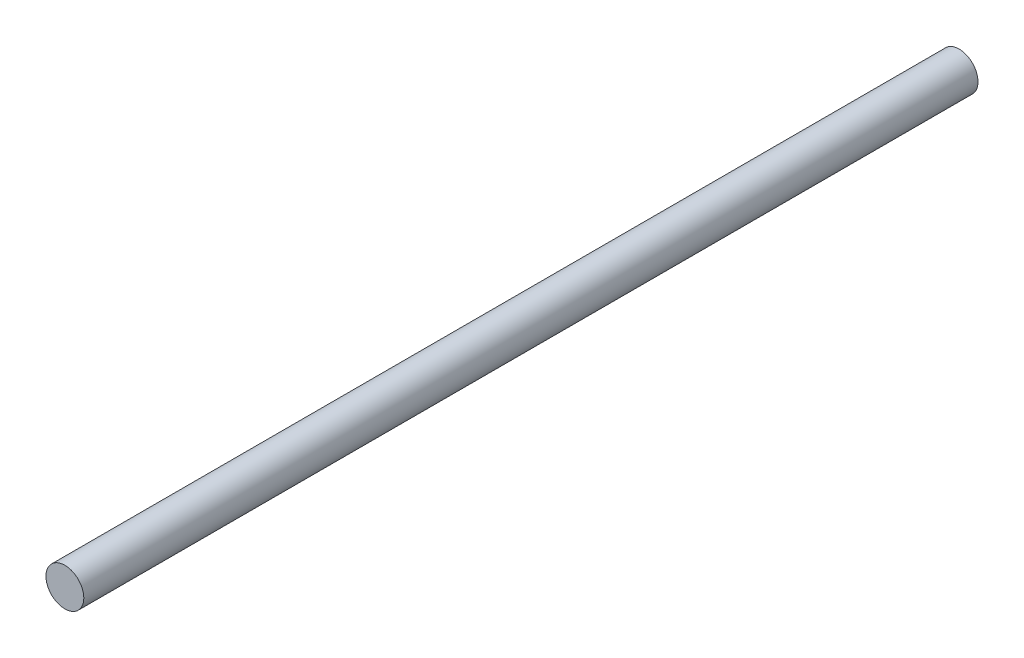
ISO-10303-21;
HEADER;
FILE_DESCRIPTION(('STEP AP214'),'2;1');
FILE_NAME('part.step','',(''),(''),'','','');
FILE_SCHEMA(('AUTOMOTIVE_DESIGN { 1 0 10303 214 1 1 1 1 }'));
ENDSEC;
DATA;
#1=APPLICATION_CONTEXT('core data for automotive mechanical design processes');
#2=APPLICATION_PROTOCOL_DEFINITION('international standard','automotive_design',2000,#1);
#3=PRODUCT_CONTEXT('',#1,'mechanical');
#4=PRODUCT('Part','Part','',(#3));
#5=PRODUCT_RELATED_PRODUCT_CATEGORY('part','',(#4));
#6=PRODUCT_DEFINITION_FORMATION('','',#4);
#7=PRODUCT_DEFINITION_CONTEXT('part definition',#1,'design');
#8=PRODUCT_DEFINITION('design','',#6,#7);
#9=PRODUCT_DEFINITION_SHAPE('','',#8);
#10=(LENGTH_UNIT() NAMED_UNIT(*) SI_UNIT(.MILLI.,.METRE.));
#11=(NAMED_UNIT(*) PLANE_ANGLE_UNIT() SI_UNIT($,.RADIAN.));
#12=(NAMED_UNIT(*) SI_UNIT($,.STERADIAN.) SOLID_ANGLE_UNIT());
#13=UNCERTAINTY_MEASURE_WITH_UNIT(LENGTH_MEASURE(1.E-05),#10,'distance_accuracy_value','');
#14=(GEOMETRIC_REPRESENTATION_CONTEXT(3) GLOBAL_UNCERTAINTY_ASSIGNED_CONTEXT((#13)) GLOBAL_UNIT_ASSIGNED_CONTEXT((#10,
#11,#12)) REPRESENTATION_CONTEXT('',''));
#15=CARTESIAN_POINT('',(0.,0.,0.));
#16=DIRECTION('',(0.,0.,1.));
#17=DIRECTION('',(1.,0.,0.));
#18=AXIS2_PLACEMENT_3D('',#15,#16,#17);
#19=CARTESIAN_POINT('',(0.,0.,130.));
#20=DIRECTION('',(0.,0.,-1.));
#21=DIRECTION('',(-1.,0.,0.));
#22=AXIS2_PLACEMENT_3D('',#19,#20,#21);
#23=CYLINDRICAL_SURFACE('',#22,2.75);
#24=CARTESIAN_POINT('',(0.,0.,130.));
#25=DIRECTION('',(0.,0.,1.));
#26=DIRECTION('',(1.,0.,0.));
#27=AXIS2_PLACEMENT_3D('',#24,#25,#26);
#28=CIRCLE('',#27,2.75);
#29=CARTESIAN_POINT('',(2.75,0.,130.));
#30=VERTEX_POINT('',#29);
#31=EDGE_CURVE('E10',#30,#30,#28,.T.);
#32=ORIENTED_EDGE('',*,*,#31,.F.);
#33=EDGE_LOOP('',(#32));
#34=FACE_BOUND('',#33,.T.);
#35=CARTESIAN_POINT('',(0.,0.,0.));
#36=DIRECTION('',(0.,0.,1.));
#37=DIRECTION('',(1.,0.,0.));
#38=AXIS2_PLACEMENT_3D('',#35,#36,#37);
#39=CIRCLE('',#38,2.75);
#40=CARTESIAN_POINT('',(2.75,0.,0.));
#41=VERTEX_POINT('',#40);
#42=EDGE_CURVE('E34',#41,#41,#39,.T.);
#43=ORIENTED_EDGE('',*,*,#42,.T.);
#44=EDGE_LOOP('',(#43));
#45=FACE_BOUND('',#44,.T.);
#46=ADVANCED_FACE('F31',(#34,#45),#23,.T.);
#47=CARTESIAN_POINT('',(0.,0.,130.));
#48=DIRECTION('',(0.,0.,1.));
#49=DIRECTION('',(1.,0.,0.));
#50=AXIS2_PLACEMENT_3D('',#47,#48,#49);
#51=PLANE('',#50);
#52=ORIENTED_EDGE('',*,*,#31,.T.);
#53=EDGE_LOOP('',(#52));
#54=FACE_BOUND('',#53,.T.);
#55=ADVANCED_FACE('F46',(#54),#51,.T.);
#56=CARTESIAN_POINT('',(0.,0.,0.));
#57=DIRECTION('',(0.,0.,1.));
#58=DIRECTION('',(1.,0.,0.));
#59=AXIS2_PLACEMENT_3D('',#56,#57,#58);
#60=PLANE('',#59);
#61=ORIENTED_EDGE('',*,*,#42,.F.);
#62=EDGE_LOOP('',(#61));
#63=FACE_BOUND('',#62,.T.);
#64=ADVANCED_FACE('F44',(#63),#60,.F.);
#65=CLOSED_SHELL('',(#46,#55,#64));
#66=MANIFOLD_SOLID_BREP('B2',#65);
#67=ADVANCED_BREP_SHAPE_REPRESENTATION('',(#18,#66),#14);
#68=SHAPE_DEFINITION_REPRESENTATION(#9,#67);
ENDSEC;
END-ISO-10303-21;
